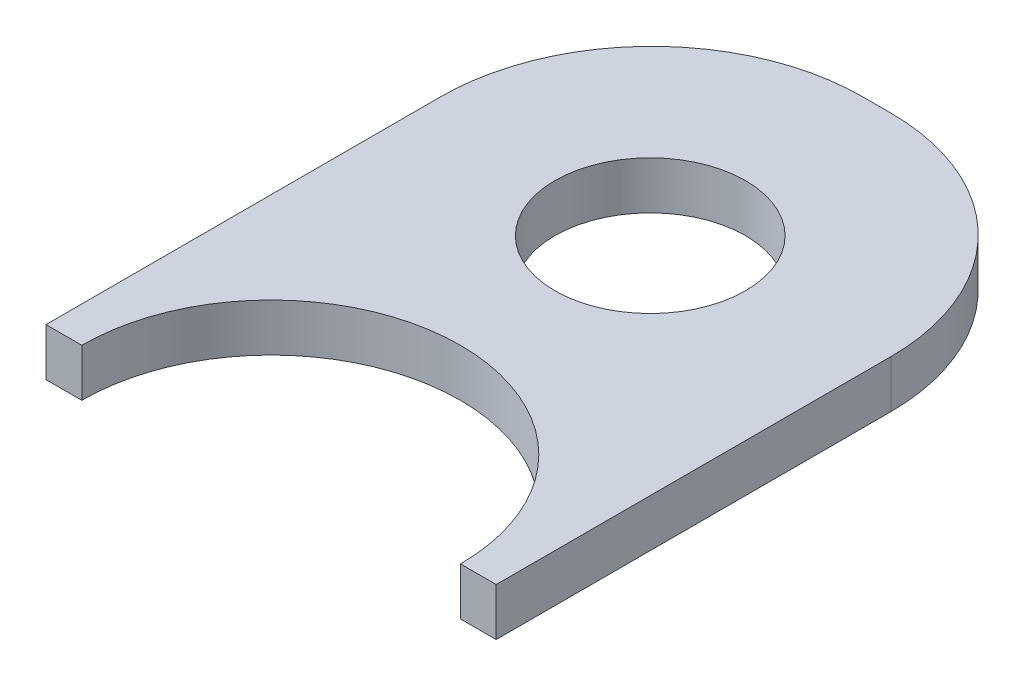
ISO-10303-21;
HEADER;
FILE_DESCRIPTION(('STEP AP214'),'2;1');
FILE_NAME('part.step','',(''),(''),'','','');
FILE_SCHEMA(('AUTOMOTIVE_DESIGN { 1 0 10303 214 1 1 1 1 }'));
ENDSEC;
DATA;
#1=APPLICATION_CONTEXT('core data for automotive mechanical design processes');
#2=APPLICATION_PROTOCOL_DEFINITION('international standard','automotive_design',2000,#1);
#3=PRODUCT_CONTEXT('',#1,'mechanical');
#4=PRODUCT('Part','Part','',(#3));
#5=PRODUCT_RELATED_PRODUCT_CATEGORY('part','',(#4));
#6=PRODUCT_DEFINITION_FORMATION('','',#4);
#7=PRODUCT_DEFINITION_CONTEXT('part definition',#1,'design');
#8=PRODUCT_DEFINITION('design','',#6,#7);
#9=PRODUCT_DEFINITION_SHAPE('','',#8);
#10=(LENGTH_UNIT() NAMED_UNIT(*) SI_UNIT(.MILLI.,.METRE.));
#11=(NAMED_UNIT(*) PLANE_ANGLE_UNIT() SI_UNIT($,.RADIAN.));
#12=(NAMED_UNIT(*) SI_UNIT($,.STERADIAN.) SOLID_ANGLE_UNIT());
#13=UNCERTAINTY_MEASURE_WITH_UNIT(LENGTH_MEASURE(1.E-05),#10,'distance_accuracy_value','');
#14=(GEOMETRIC_REPRESENTATION_CONTEXT(3) GLOBAL_UNCERTAINTY_ASSIGNED_CONTEXT((#13)) GLOBAL_UNIT_ASSIGNED_CONTEXT((#10,
#11,#12)) REPRESENTATION_CONTEXT('',''));
#15=CARTESIAN_POINT('',(0.,0.,0.));
#16=DIRECTION('',(0.,0.,1.));
#17=DIRECTION('',(1.,0.,0.));
#18=AXIS2_PLACEMENT_3D('',#15,#16,#17);
#19=CARTESIAN_POINT('',(-18.88,4.,0.));
#20=DIRECTION('',(0.,1.,0.));
#21=DIRECTION('',(0.,0.,1.));
#22=AXIS2_PLACEMENT_3D('',#19,#20,#21);
#23=PLANE('',#22);
#24=DIRECTION('',(0.,0.,-1.));
#25=VECTOR('',#24,1.);
#26=CARTESIAN_POINT('',(0.,4.,-33.1009999999999));
#27=LINE('',#26,#25);
#28=CARTESIAN_POINT('',(0.,4.,0.));
#29=VERTEX_POINT('',#28);
#30=CARTESIAN_POINT('',(0.,4.,-33.1009999999999));
#31=VERTEX_POINT('',#30);
#32=EDGE_CURVE('E153',#29,#31,#27,.T.);
#33=ORIENTED_EDGE('',*,*,#32,.T.);
#34=CARTESIAN_POINT('',(-17.699,4.,-33.101));
#35=DIRECTION('',(0.,1.,0.));
#36=DIRECTION('',(0.,0.,-1.));
#37=AXIS2_PLACEMENT_3D('',#34,#35,#36);
#38=CIRCLE('',#37,17.699);
#39=CARTESIAN_POINT('',(-17.6990000000001,4.,-50.8));
#40=VERTEX_POINT('',#39);
#41=EDGE_CURVE('E101',#31,#40,#38,.T.);
#42=ORIENTED_EDGE('',*,*,#41,.T.);
#43=DIRECTION('',(-1.,0.,0.));
#44=VECTOR('',#43,1.);
#45=CARTESIAN_POINT('',(-20.061,4.,-50.8));
#46=LINE('',#45,#44);
#47=CARTESIAN_POINT('',(-20.061,4.,-50.8));
#48=VERTEX_POINT('',#47);
#49=EDGE_CURVE('E168',#40,#48,#46,.T.);
#50=ORIENTED_EDGE('',*,*,#49,.T.);
#51=CARTESIAN_POINT('',(-20.061,4.,-33.101));
#52=DIRECTION('',(0.,1.,0.));
#53=DIRECTION('',(0.,0.,1.));
#54=AXIS2_PLACEMENT_3D('',#51,#52,#53);
#55=CIRCLE('',#54,17.699);
#56=CARTESIAN_POINT('',(-37.76,4.,-33.101));
#57=VERTEX_POINT('',#56);
#58=EDGE_CURVE('E181',#48,#57,#55,.T.);
#59=ORIENTED_EDGE('',*,*,#58,.T.);
#60=DIRECTION('',(0.,0.,1.));
#61=VECTOR('',#60,1.);
#62=CARTESIAN_POINT('',(-37.76,4.,0.));
#63=LINE('',#62,#61);
#64=CARTESIAN_POINT('',(-37.76,4.,0.));
#65=VERTEX_POINT('',#64);
#66=EDGE_CURVE('E120',#57,#65,#63,.T.);
#67=ORIENTED_EDGE('',*,*,#66,.T.);
#68=DIRECTION('',(1.,0.,0.));
#69=VECTOR('',#68,1.);
#70=CARTESIAN_POINT('',(-34.76,4.,0.));
#71=LINE('',#70,#69);
#72=CARTESIAN_POINT('',(-34.76,4.,0.));
#73=VERTEX_POINT('',#72);
#74=EDGE_CURVE('E114',#65,#73,#71,.T.);
#75=ORIENTED_EDGE('',*,*,#74,.T.);
#76=CARTESIAN_POINT('',(-18.88,4.,0.));
#77=DIRECTION('',(0.,-1.,0.));
#78=DIRECTION('',(0.,0.,1.));
#79=AXIS2_PLACEMENT_3D('',#76,#77,#78);
#80=CIRCLE('',#79,15.88);
#81=CARTESIAN_POINT('',(-3.,4.,0.));
#82=VERTEX_POINT('',#81);
#83=EDGE_CURVE('E118',#73,#82,#80,.T.);
#84=ORIENTED_EDGE('',*,*,#83,.T.);
#85=DIRECTION('',(1.,0.,0.));
#86=VECTOR('',#85,1.);
#87=CARTESIAN_POINT('',(0.,4.,0.));
#88=LINE('',#87,#86);
#89=EDGE_CURVE('E58',#82,#29,#88,.T.);
#90=ORIENTED_EDGE('',*,*,#89,.T.);
#91=EDGE_LOOP('',(#33,#42,#50,#59,#67,#75,#84,#90));
#92=FACE_BOUND('',#91,.T.);
#93=CARTESIAN_POINT('',(-18.88,4.,-31.8));
#94=DIRECTION('',(0.,1.,0.));
#95=DIRECTION('',(0.,0.,1.));
#96=AXIS2_PLACEMENT_3D('',#93,#94,#95);
#97=CIRCLE('',#96,8.);
#98=CARTESIAN_POINT('',(-18.88,4.,-23.8));
#99=VERTEX_POINT('',#98);
#100=EDGE_CURVE('E142',#99,#99,#97,.T.);
#101=ORIENTED_EDGE('',*,*,#100,.F.);
#102=EDGE_LOOP('',(#101));
#103=FACE_BOUND('',#102,.T.);
#104=ADVANCED_FACE('F41',(#92,#103),#23,.T.);
#105=CARTESIAN_POINT('',(-18.88,0.,0.));
#106=DIRECTION('',(0.,1.,0.));
#107=DIRECTION('',(0.,0.,1.));
#108=AXIS2_PLACEMENT_3D('',#105,#106,#107);
#109=PLANE('',#108);
#110=DIRECTION('',(0.,0.,-1.));
#111=VECTOR('',#110,1.);
#112=CARTESIAN_POINT('',(0.,0.,-33.1009999999999));
#113=LINE('',#112,#111);
#114=CARTESIAN_POINT('',(0.,0.,0.));
#115=VERTEX_POINT('',#114);
#116=CARTESIAN_POINT('',(0.,0.,-33.1009999999999));
#117=VERTEX_POINT('',#116);
#118=EDGE_CURVE('E138',#115,#117,#113,.T.);
#119=ORIENTED_EDGE('',*,*,#118,.F.);
#120=DIRECTION('',(1.,0.,0.));
#121=VECTOR('',#120,1.);
#122=CARTESIAN_POINT('',(0.,0.,0.));
#123=LINE('',#122,#121);
#124=CARTESIAN_POINT('',(-3.,0.,0.));
#125=VERTEX_POINT('',#124);
#126=EDGE_CURVE('E93',#125,#115,#123,.T.);
#127=ORIENTED_EDGE('',*,*,#126,.F.);
#128=CARTESIAN_POINT('',(-18.88,0.,0.));
#129=DIRECTION('',(0.,-1.,0.));
#130=DIRECTION('',(0.,0.,1.));
#131=AXIS2_PLACEMENT_3D('',#128,#129,#130);
#132=CIRCLE('',#131,15.88);
#133=CARTESIAN_POINT('',(-34.76,0.,0.));
#134=VERTEX_POINT('',#133);
#135=EDGE_CURVE('E87',#134,#125,#132,.T.);
#136=ORIENTED_EDGE('',*,*,#135,.F.);
#137=DIRECTION('',(1.,0.,0.));
#138=VECTOR('',#137,1.);
#139=CARTESIAN_POINT('',(-34.76,0.,0.));
#140=LINE('',#139,#138);
#141=CARTESIAN_POINT('',(-37.76,0.,0.));
#142=VERTEX_POINT('',#141);
#143=EDGE_CURVE('E128',#142,#134,#140,.T.);
#144=ORIENTED_EDGE('',*,*,#143,.F.);
#145=DIRECTION('',(0.,0.,1.));
#146=VECTOR('',#145,1.);
#147=CARTESIAN_POINT('',(-37.76,0.,0.));
#148=LINE('',#147,#146);
#149=CARTESIAN_POINT('',(-37.76,0.,-33.101));
#150=VERTEX_POINT('',#149);
#151=EDGE_CURVE('E148',#150,#142,#148,.T.);
#152=ORIENTED_EDGE('',*,*,#151,.F.);
#153=CARTESIAN_POINT('',(-20.061,0.,-33.101));
#154=DIRECTION('',(0.,1.,0.));
#155=DIRECTION('',(0.,0.,1.));
#156=AXIS2_PLACEMENT_3D('',#153,#154,#155);
#157=CIRCLE('',#156,17.699);
#158=CARTESIAN_POINT('',(-20.061,0.,-50.8));
#159=VERTEX_POINT('',#158);
#160=EDGE_CURVE('E146',#159,#150,#157,.T.);
#161=ORIENTED_EDGE('',*,*,#160,.F.);
#162=DIRECTION('',(-1.,0.,0.));
#163=VECTOR('',#162,1.);
#164=CARTESIAN_POINT('',(-20.061,0.,-50.8));
#165=LINE('',#164,#163);
#166=CARTESIAN_POINT('',(-17.6990000000001,0.,-50.8));
#167=VERTEX_POINT('',#166);
#168=EDGE_CURVE('E144',#167,#159,#165,.T.);
#169=ORIENTED_EDGE('',*,*,#168,.F.);
#170=CARTESIAN_POINT('',(-17.699,0.,-33.101));
#171=DIRECTION('',(0.,1.,0.));
#172=DIRECTION('',(0.,0.,-1.));
#173=AXIS2_PLACEMENT_3D('',#170,#171,#172);
#174=CIRCLE('',#173,17.699);
#175=EDGE_CURVE('E141',#117,#167,#174,.T.);
#176=ORIENTED_EDGE('',*,*,#175,.F.);
#177=EDGE_LOOP('',(#119,#127,#136,#144,#152,#161,#169,#176));
#178=FACE_BOUND('',#177,.T.);
#179=CARTESIAN_POINT('',(-18.88,0.,-31.8));
#180=DIRECTION('',(0.,1.,0.));
#181=DIRECTION('',(0.,0.,1.));
#182=AXIS2_PLACEMENT_3D('',#179,#180,#181);
#183=CIRCLE('',#182,8.);
#184=CARTESIAN_POINT('',(-18.88,0.,-23.8));
#185=VERTEX_POINT('',#184);
#186=EDGE_CURVE('E187',#185,#185,#183,.T.);
#187=ORIENTED_EDGE('',*,*,#186,.T.);
#188=EDGE_LOOP('',(#187));
#189=FACE_BOUND('',#188,.T.);
#190=ADVANCED_FACE('F172',(#178,#189),#109,.F.);
#191=CARTESIAN_POINT('',(0.,4.,-33.1009999999999));
#192=DIRECTION('',(-1.,0.,0.));
#193=DIRECTION('',(0.,0.,1.));
#194=AXIS2_PLACEMENT_3D('',#191,#192,#193);
#195=PLANE('',#194);
#196=ORIENTED_EDGE('',*,*,#118,.T.);
#197=DIRECTION('',(0.,-1.,0.));
#198=VECTOR('',#197,1.);
#199=CARTESIAN_POINT('',(0.,4.,-33.1009999999999));
#200=LINE('',#199,#198);
#201=EDGE_CURVE('E11',#31,#117,#200,.T.);
#202=ORIENTED_EDGE('',*,*,#201,.F.);
#203=ORIENTED_EDGE('',*,*,#32,.F.);
#204=DIRECTION('',(0.,-1.,0.));
#205=VECTOR('',#204,1.);
#206=CARTESIAN_POINT('',(0.,4.,0.));
#207=LINE('',#206,#205);
#208=EDGE_CURVE('E134',#29,#115,#207,.T.);
#209=ORIENTED_EDGE('',*,*,#208,.T.);
#210=EDGE_LOOP('',(#196,#202,#203,#209));
#211=FACE_BOUND('',#210,.T.);
#212=ADVANCED_FACE('F43',(#211),#195,.F.);
#213=CARTESIAN_POINT('',(-17.699,4.,-33.101));
#214=DIRECTION('',(0.,-1.,0.));
#215=DIRECTION('',(0.,0.,-1.));
#216=AXIS2_PLACEMENT_3D('',#213,#214,#215);
#217=CYLINDRICAL_SURFACE('',#216,17.699);
#218=ORIENTED_EDGE('',*,*,#175,.T.);
#219=DIRECTION('',(0.,-1.,0.));
#220=VECTOR('',#219,1.);
#221=CARTESIAN_POINT('',(-17.6990000000001,4.,-50.8));
#222=LINE('',#221,#220);
#223=EDGE_CURVE('E50',#40,#167,#222,.T.);
#224=ORIENTED_EDGE('',*,*,#223,.F.);
#225=ORIENTED_EDGE('',*,*,#41,.F.);
#226=ORIENTED_EDGE('',*,*,#201,.T.);
#227=EDGE_LOOP('',(#218,#224,#225,#226));
#228=FACE_BOUND('',#227,.T.);
#229=ADVANCED_FACE('F215',(#228),#217,.T.);
#230=CARTESIAN_POINT('',(-20.061,4.,-50.8));
#231=DIRECTION('',(0.,0.,1.));
#232=DIRECTION('',(1.,0.,0.));
#233=AXIS2_PLACEMENT_3D('',#230,#231,#232);
#234=PLANE('',#233);
#235=ORIENTED_EDGE('',*,*,#168,.T.);
#236=DIRECTION('',(0.,-1.,0.));
#237=VECTOR('',#236,1.);
#238=CARTESIAN_POINT('',(-20.061,4.,-50.8));
#239=LINE('',#238,#237);
#240=EDGE_CURVE('E160',#48,#159,#239,.T.);
#241=ORIENTED_EDGE('',*,*,#240,.F.);
#242=ORIENTED_EDGE('',*,*,#49,.F.);
#243=ORIENTED_EDGE('',*,*,#223,.T.);
#244=EDGE_LOOP('',(#235,#241,#242,#243));
#245=FACE_BOUND('',#244,.T.);
#246=ADVANCED_FACE('F166',(#245),#234,.F.);
#247=CARTESIAN_POINT('',(-20.061,4.,-33.101));
#248=DIRECTION('',(0.,-1.,0.));
#249=DIRECTION('',(0.,0.,-1.));
#250=AXIS2_PLACEMENT_3D('',#247,#248,#249);
#251=CYLINDRICAL_SURFACE('',#250,17.699);
#252=ORIENTED_EDGE('',*,*,#160,.T.);
#253=DIRECTION('',(0.,-1.,0.));
#254=VECTOR('',#253,1.);
#255=CARTESIAN_POINT('',(-37.76,4.,-33.101));
#256=LINE('',#255,#254);
#257=EDGE_CURVE('E157',#57,#150,#256,.T.);
#258=ORIENTED_EDGE('',*,*,#257,.F.);
#259=ORIENTED_EDGE('',*,*,#58,.F.);
#260=ORIENTED_EDGE('',*,*,#240,.T.);
#261=EDGE_LOOP('',(#252,#258,#259,#260));
#262=FACE_BOUND('',#261,.T.);
#263=ADVANCED_FACE('F177',(#262),#251,.T.);
#264=CARTESIAN_POINT('',(-37.76,4.,0.));
#265=DIRECTION('',(1.,0.,0.));
#266=DIRECTION('',(0.,0.,-1.));
#267=AXIS2_PLACEMENT_3D('',#264,#265,#266);
#268=PLANE('',#267);
#269=ORIENTED_EDGE('',*,*,#151,.T.);
#270=DIRECTION('',(0.,-1.,0.));
#271=VECTOR('',#270,1.);
#272=CARTESIAN_POINT('',(-37.76,4.,0.));
#273=LINE('',#272,#271);
#274=EDGE_CURVE('E129',#65,#142,#273,.T.);
#275=ORIENTED_EDGE('',*,*,#274,.F.);
#276=ORIENTED_EDGE('',*,*,#66,.F.);
#277=ORIENTED_EDGE('',*,*,#257,.T.);
#278=EDGE_LOOP('',(#269,#275,#276,#277));
#279=FACE_BOUND('',#278,.T.);
#280=ADVANCED_FACE('F180',(#279),#268,.F.);
#281=CARTESIAN_POINT('',(-34.76,4.,0.));
#282=DIRECTION('',(0.,0.,-1.));
#283=DIRECTION('',(-1.,0.,0.));
#284=AXIS2_PLACEMENT_3D('',#281,#282,#283);
#285=PLANE('',#284);
#286=ORIENTED_EDGE('',*,*,#143,.T.);
#287=DIRECTION('',(0.,-1.,0.));
#288=VECTOR('',#287,1.);
#289=CARTESIAN_POINT('',(-34.76,4.,0.));
#290=LINE('',#289,#288);
#291=EDGE_CURVE('E125',#73,#134,#290,.T.);
#292=ORIENTED_EDGE('',*,*,#291,.F.);
#293=ORIENTED_EDGE('',*,*,#74,.F.);
#294=ORIENTED_EDGE('',*,*,#274,.T.);
#295=EDGE_LOOP('',(#286,#292,#293,#294));
#296=FACE_BOUND('',#295,.T.);
#297=ADVANCED_FACE('F126',(#296),#285,.F.);
#298=CARTESIAN_POINT('',(-18.88,4.,0.));
#299=DIRECTION('',(0.,-1.,0.));
#300=DIRECTION('',(0.,0.,-1.));
#301=AXIS2_PLACEMENT_3D('',#298,#299,#300);
#302=CYLINDRICAL_SURFACE('',#301,15.88);
#303=ORIENTED_EDGE('',*,*,#135,.T.);
#304=DIRECTION('',(0.,-1.,0.));
#305=VECTOR('',#304,1.);
#306=CARTESIAN_POINT('',(-3.,4.,0.));
#307=LINE('',#306,#305);
#308=EDGE_CURVE('E130',#82,#125,#307,.T.);
#309=ORIENTED_EDGE('',*,*,#308,.F.);
#310=ORIENTED_EDGE('',*,*,#83,.F.);
#311=ORIENTED_EDGE('',*,*,#291,.T.);
#312=EDGE_LOOP('',(#303,#309,#310,#311));
#313=FACE_BOUND('',#312,.T.);
#314=ADVANCED_FACE('F132',(#313),#302,.F.);
#315=CARTESIAN_POINT('',(0.,4.,0.));
#316=DIRECTION('',(0.,0.,-1.));
#317=DIRECTION('',(-1.,0.,0.));
#318=AXIS2_PLACEMENT_3D('',#315,#316,#317);
#319=PLANE('',#318);
#320=ORIENTED_EDGE('',*,*,#126,.T.);
#321=ORIENTED_EDGE('',*,*,#208,.F.);
#322=ORIENTED_EDGE('',*,*,#89,.F.);
#323=ORIENTED_EDGE('',*,*,#308,.T.);
#324=EDGE_LOOP('',(#320,#321,#322,#323));
#325=FACE_BOUND('',#324,.T.);
#326=ADVANCED_FACE('F203',(#325),#319,.F.);
#327=CARTESIAN_POINT('',(-18.88,4.,-31.8));
#328=DIRECTION('',(0.,-1.,0.));
#329=DIRECTION('',(0.,0.,-1.));
#330=AXIS2_PLACEMENT_3D('',#327,#328,#329);
#331=CYLINDRICAL_SURFACE('',#330,8.);
#332=ORIENTED_EDGE('',*,*,#100,.T.);
#333=EDGE_LOOP('',(#332));
#334=FACE_BOUND('',#333,.T.);
#335=ORIENTED_EDGE('',*,*,#186,.F.);
#336=EDGE_LOOP('',(#335));
#337=FACE_BOUND('',#336,.T.);
#338=ADVANCED_FACE('F193',(#334,#337),#331,.F.);
#339=CLOSED_SHELL('',(#104,#190,#212,#229,#246,#263,#280,#297,#314,#326,#338));
#340=MANIFOLD_SOLID_BREP('B2',#339);
#341=ADVANCED_BREP_SHAPE_REPRESENTATION('',(#18,#340),#14);
#342=SHAPE_DEFINITION_REPRESENTATION(#9,#341);
ENDSEC;
END-ISO-10303-21;
